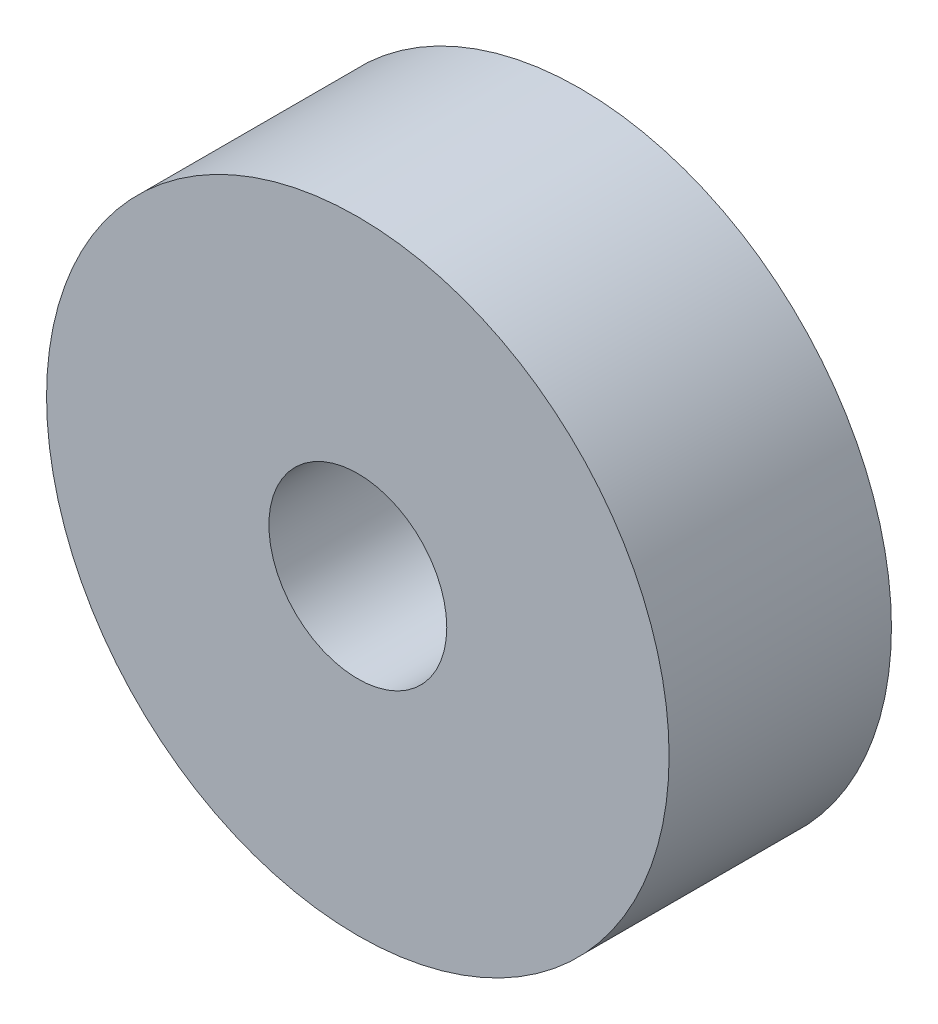
ISO-10303-21;
HEADER;
FILE_DESCRIPTION(('STEP AP214'),'2;1');
FILE_NAME('part.step','',(''),(''),'','','');
FILE_SCHEMA(('AUTOMOTIVE_DESIGN { 1 0 10303 214 1 1 1 1 }'));
ENDSEC;
DATA;
#1=APPLICATION_CONTEXT('core data for automotive mechanical design processes');
#2=APPLICATION_PROTOCOL_DEFINITION('international standard','automotive_design',2000,#1);
#3=PRODUCT_CONTEXT('',#1,'mechanical');
#4=PRODUCT('Part','Part','',(#3));
#5=PRODUCT_RELATED_PRODUCT_CATEGORY('part','',(#4));
#6=PRODUCT_DEFINITION_FORMATION('','',#4);
#7=PRODUCT_DEFINITION_CONTEXT('part definition',#1,'design');
#8=PRODUCT_DEFINITION('design','',#6,#7);
#9=PRODUCT_DEFINITION_SHAPE('','',#8);
#10=(LENGTH_UNIT() NAMED_UNIT(*) SI_UNIT(.MILLI.,.METRE.));
#11=(NAMED_UNIT(*) PLANE_ANGLE_UNIT() SI_UNIT($,.RADIAN.));
#12=(NAMED_UNIT(*) SI_UNIT($,.STERADIAN.) SOLID_ANGLE_UNIT());
#13=UNCERTAINTY_MEASURE_WITH_UNIT(LENGTH_MEASURE(1.E-05),#10,'distance_accuracy_value','');
#14=(GEOMETRIC_REPRESENTATION_CONTEXT(3) GLOBAL_UNCERTAINTY_ASSIGNED_CONTEXT((#13)) GLOBAL_UNIT_ASSIGNED_CONTEXT((#10,
#11,#12)) REPRESENTATION_CONTEXT('',''));
#15=CARTESIAN_POINT('',(0.,0.,0.));
#16=DIRECTION('',(0.,0.,1.));
#17=DIRECTION('',(1.,0.,0.));
#18=AXIS2_PLACEMENT_3D('',#15,#16,#17);
#19=CARTESIAN_POINT('',(0.,0.,10.));
#20=DIRECTION('',(0.,0.,1.));
#21=DIRECTION('',(1.,0.,0.));
#22=AXIS2_PLACEMENT_3D('',#19,#20,#21);
#23=PLANE('',#22);
#24=CARTESIAN_POINT('',(0.,0.,10.));
#25=DIRECTION('',(0.,0.,1.));
#26=DIRECTION('',(1.,0.,0.));
#27=AXIS2_PLACEMENT_3D('',#24,#25,#26);
#28=CIRCLE('',#27,14.);
#29=CARTESIAN_POINT('',(14.,0.,10.));
#30=VERTEX_POINT('',#29);
#31=EDGE_CURVE('E10',#30,#30,#28,.T.);
#32=ORIENTED_EDGE('',*,*,#31,.T.);
#33=EDGE_LOOP('',(#32));
#34=FACE_BOUND('',#33,.T.);
#35=CARTESIAN_POINT('',(0.,0.,10.));
#36=DIRECTION('',(0.,0.,1.));
#37=DIRECTION('',(1.,0.,0.));
#38=AXIS2_PLACEMENT_3D('',#35,#36,#37);
#39=CIRCLE('',#38,4.);
#40=CARTESIAN_POINT('',(4.,0.,10.));
#41=VERTEX_POINT('',#40);
#42=EDGE_CURVE('E42',#41,#41,#39,.T.);
#43=ORIENTED_EDGE('',*,*,#42,.F.);
#44=EDGE_LOOP('',(#43));
#45=FACE_BOUND('',#44,.T.);
#46=ADVANCED_FACE('F31',(#34,#45),#23,.T.);
#47=CARTESIAN_POINT('',(0.,0.,0.));
#48=DIRECTION('',(0.,0.,1.));
#49=DIRECTION('',(1.,0.,0.));
#50=AXIS2_PLACEMENT_3D('',#47,#48,#49);
#51=PLANE('',#50);
#52=CARTESIAN_POINT('',(0.,0.,0.));
#53=DIRECTION('',(0.,0.,1.));
#54=DIRECTION('',(1.,0.,0.));
#55=AXIS2_PLACEMENT_3D('',#52,#53,#54);
#56=CIRCLE('',#55,14.);
#57=CARTESIAN_POINT('',(14.,0.,0.));
#58=VERTEX_POINT('',#57);
#59=EDGE_CURVE('E35',#58,#58,#56,.T.);
#60=ORIENTED_EDGE('',*,*,#59,.F.);
#61=EDGE_LOOP('',(#60));
#62=FACE_BOUND('',#61,.T.);
#63=CARTESIAN_POINT('',(0.,0.,0.));
#64=DIRECTION('',(0.,0.,1.));
#65=DIRECTION('',(1.,0.,0.));
#66=AXIS2_PLACEMENT_3D('',#63,#64,#65);
#67=CIRCLE('',#66,4.);
#68=CARTESIAN_POINT('',(4.,0.,0.));
#69=VERTEX_POINT('',#68);
#70=EDGE_CURVE('E44',#69,#69,#67,.T.);
#71=ORIENTED_EDGE('',*,*,#70,.T.);
#72=EDGE_LOOP('',(#71));
#73=FACE_BOUND('',#72,.T.);
#74=ADVANCED_FACE('F54',(#62,#73),#51,.F.);
#75=CARTESIAN_POINT('',(0.,0.,10.));
#76=DIRECTION('',(0.,0.,-1.));
#77=DIRECTION('',(-1.,0.,0.));
#78=AXIS2_PLACEMENT_3D('',#75,#76,#77);
#79=CYLINDRICAL_SURFACE('',#78,14.);
#80=ORIENTED_EDGE('',*,*,#31,.F.);
#81=EDGE_LOOP('',(#80));
#82=FACE_BOUND('',#81,.T.);
#83=ORIENTED_EDGE('',*,*,#59,.T.);
#84=EDGE_LOOP('',(#83));
#85=FACE_BOUND('',#84,.T.);
#86=ADVANCED_FACE('F33',(#82,#85),#79,.T.);
#87=CARTESIAN_POINT('',(0.,0.,10.));
#88=DIRECTION('',(0.,0.,-1.));
#89=DIRECTION('',(-1.,0.,0.));
#90=AXIS2_PLACEMENT_3D('',#87,#88,#89);
#91=CYLINDRICAL_SURFACE('',#90,4.);
#92=ORIENTED_EDGE('',*,*,#42,.T.);
#93=EDGE_LOOP('',(#92));
#94=FACE_BOUND('',#93,.T.);
#95=ORIENTED_EDGE('',*,*,#70,.F.);
#96=EDGE_LOOP('',(#95));
#97=FACE_BOUND('',#96,.T.);
#98=ADVANCED_FACE('F50',(#94,#97),#91,.F.);
#99=CLOSED_SHELL('',(#46,#74,#86,#98));
#100=MANIFOLD_SOLID_BREP('B2',#99);
#101=ADVANCED_BREP_SHAPE_REPRESENTATION('',(#18,#100),#14);
#102=SHAPE_DEFINITION_REPRESENTATION(#9,#101);
ENDSEC;
END-ISO-10303-21;
